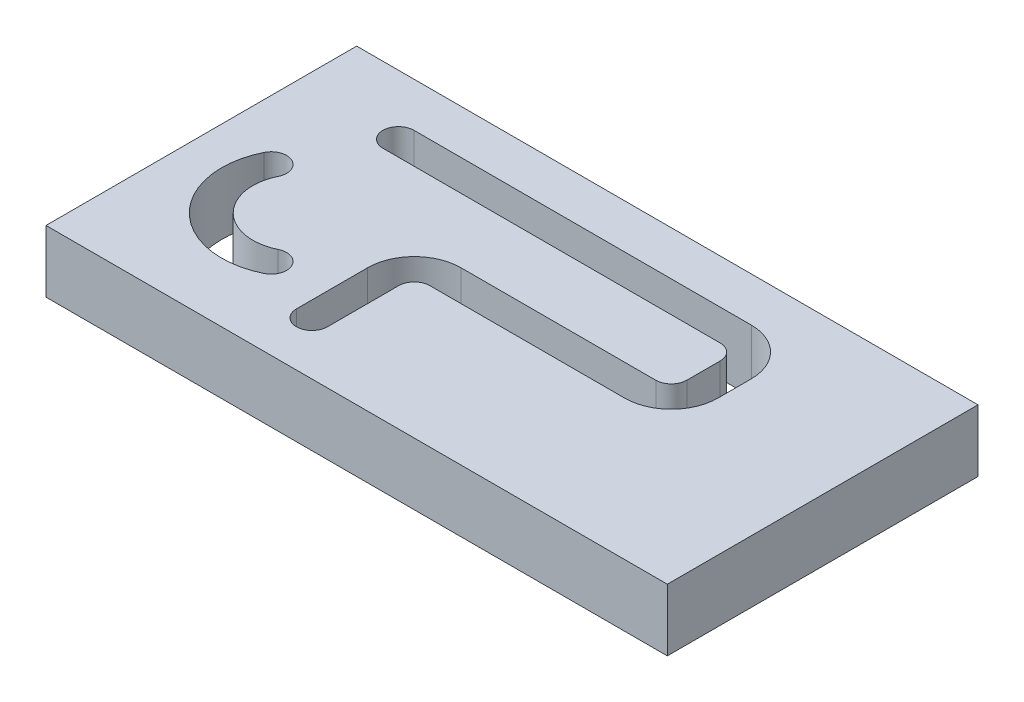
ISO-10303-21;
HEADER;
FILE_DESCRIPTION(('STEP AP214'),'2;1');
FILE_NAME('part.step','',(''),(''),'','','');
FILE_SCHEMA(('AUTOMOTIVE_DESIGN { 1 0 10303 214 1 1 1 1 }'));
ENDSEC;
DATA;
#1=APPLICATION_CONTEXT('core data for automotive mechanical design processes');
#2=APPLICATION_PROTOCOL_DEFINITION('international standard','automotive_design',2000,#1);
#3=PRODUCT_CONTEXT('',#1,'mechanical');
#4=PRODUCT('Part','Part','',(#3));
#5=PRODUCT_RELATED_PRODUCT_CATEGORY('part','',(#4));
#6=PRODUCT_DEFINITION_FORMATION('','',#4);
#7=PRODUCT_DEFINITION_CONTEXT('part definition',#1,'design');
#8=PRODUCT_DEFINITION('design','',#6,#7);
#9=PRODUCT_DEFINITION_SHAPE('','',#8);
#10=(LENGTH_UNIT() NAMED_UNIT(*) SI_UNIT(.MILLI.,.METRE.));
#11=(NAMED_UNIT(*) PLANE_ANGLE_UNIT() SI_UNIT($,.RADIAN.));
#12=(NAMED_UNIT(*) SI_UNIT($,.STERADIAN.) SOLID_ANGLE_UNIT());
#13=UNCERTAINTY_MEASURE_WITH_UNIT(LENGTH_MEASURE(1.E-05),#10,'distance_accuracy_value','');
#14=(GEOMETRIC_REPRESENTATION_CONTEXT(3) GLOBAL_UNCERTAINTY_ASSIGNED_CONTEXT((#13)) GLOBAL_UNIT_ASSIGNED_CONTEXT((#10,
#11,#12)) REPRESENTATION_CONTEXT('',''));
#15=CARTESIAN_POINT('',(0.,0.,0.));
#16=DIRECTION('',(0.,0.,1.));
#17=DIRECTION('',(1.,0.,0.));
#18=AXIS2_PLACEMENT_3D('',#15,#16,#17);
#19=CARTESIAN_POINT('',(-127.,25.4,63.5));
#20=DIRECTION('',(1.,0.,0.));
#21=DIRECTION('',(0.,0.,-1.));
#22=AXIS2_PLACEMENT_3D('',#19,#20,#21);
#23=PLANE('',#22);
#24=DIRECTION('',(0.,0.,1.));
#25=VECTOR('',#24,1.);
#26=CARTESIAN_POINT('',(-127.,0.,63.5));
#27=LINE('',#26,#25);
#28=CARTESIAN_POINT('',(-127.,0.,-63.5));
#29=VERTEX_POINT('',#28);
#30=CARTESIAN_POINT('',(-127.,0.,63.5));
#31=VERTEX_POINT('',#30);
#32=EDGE_CURVE('E327',#29,#31,#27,.T.);
#33=ORIENTED_EDGE('',*,*,#32,.T.);
#34=DIRECTION('',(0.,-1.,0.));
#35=VECTOR('',#34,1.);
#36=CARTESIAN_POINT('',(-127.,25.4,63.5));
#37=LINE('',#36,#35);
#38=CARTESIAN_POINT('',(-127.,25.4,63.5));
#39=VERTEX_POINT('',#38);
#40=EDGE_CURVE('E11',#39,#31,#37,.T.);
#41=ORIENTED_EDGE('',*,*,#40,.F.);
#42=DIRECTION('',(0.,0.,1.));
#43=VECTOR('',#42,1.);
#44=CARTESIAN_POINT('',(-127.,25.4,63.5));
#45=LINE('',#44,#43);
#46=CARTESIAN_POINT('',(-127.,25.4,-63.5));
#47=VERTEX_POINT('',#46);
#48=EDGE_CURVE('E358',#47,#39,#45,.T.);
#49=ORIENTED_EDGE('',*,*,#48,.F.);
#50=DIRECTION('',(0.,-1.,0.));
#51=VECTOR('',#50,1.);
#52=CARTESIAN_POINT('',(-127.,25.4,-63.5));
#53=LINE('',#52,#51);
#54=EDGE_CURVE('E368',#47,#29,#53,.T.);
#55=ORIENTED_EDGE('',*,*,#54,.T.);
#56=EDGE_LOOP('',(#33,#41,#49,#55));
#57=FACE_BOUND('',#56,.T.);
#58=ADVANCED_FACE('F33',(#57),#23,.F.);
#59=CARTESIAN_POINT('',(127.,25.4,63.5));
#60=DIRECTION('',(0.,0.,-1.));
#61=DIRECTION('',(-1.,0.,0.));
#62=AXIS2_PLACEMENT_3D('',#59,#60,#61);
#63=PLANE('',#62);
#64=DIRECTION('',(1.,0.,0.));
#65=VECTOR('',#64,1.);
#66=CARTESIAN_POINT('',(127.,0.,63.5));
#67=LINE('',#66,#65);
#68=CARTESIAN_POINT('',(127.,0.,63.5));
#69=VERTEX_POINT('',#68);
#70=EDGE_CURVE('E371',#31,#69,#67,.T.);
#71=ORIENTED_EDGE('',*,*,#70,.T.);
#72=DIRECTION('',(0.,-1.,0.));
#73=VECTOR('',#72,1.);
#74=CARTESIAN_POINT('',(127.,25.4,63.5));
#75=LINE('',#74,#73);
#76=CARTESIAN_POINT('',(127.,25.4,63.5));
#77=VERTEX_POINT('',#76);
#78=EDGE_CURVE('E40',#77,#69,#75,.T.);
#79=ORIENTED_EDGE('',*,*,#78,.F.);
#80=DIRECTION('',(1.,0.,0.));
#81=VECTOR('',#80,1.);
#82=CARTESIAN_POINT('',(127.,25.4,63.5));
#83=LINE('',#82,#81);
#84=EDGE_CURVE('E361',#39,#77,#83,.T.);
#85=ORIENTED_EDGE('',*,*,#84,.F.);
#86=ORIENTED_EDGE('',*,*,#40,.T.);
#87=EDGE_LOOP('',(#71,#79,#85,#86));
#88=FACE_BOUND('',#87,.T.);
#89=ADVANCED_FACE('F400',(#88),#63,.F.);
#90=CARTESIAN_POINT('',(127.,25.4,63.5));
#91=DIRECTION('',(-1.,0.,0.));
#92=DIRECTION('',(0.,0.,1.));
#93=AXIS2_PLACEMENT_3D('',#90,#91,#92);
#94=PLANE('',#93);
#95=DIRECTION('',(0.,0.,-1.));
#96=VECTOR('',#95,1.);
#97=CARTESIAN_POINT('',(127.,0.,63.5));
#98=LINE('',#97,#96);
#99=CARTESIAN_POINT('',(127.,0.,-63.5));
#100=VERTEX_POINT('',#99);
#101=EDGE_CURVE('E373',#69,#100,#98,.T.);
#102=ORIENTED_EDGE('',*,*,#101,.T.);
#103=DIRECTION('',(0.,-1.,0.));
#104=VECTOR('',#103,1.);
#105=CARTESIAN_POINT('',(127.,25.4,-63.5));
#106=LINE('',#105,#104);
#107=CARTESIAN_POINT('',(127.,25.4,-63.5));
#108=VERTEX_POINT('',#107);
#109=EDGE_CURVE('E378',#108,#100,#106,.T.);
#110=ORIENTED_EDGE('',*,*,#109,.F.);
#111=DIRECTION('',(0.,0.,-1.));
#112=VECTOR('',#111,1.);
#113=CARTESIAN_POINT('',(127.,25.4,63.5));
#114=LINE('',#113,#112);
#115=EDGE_CURVE('E364',#77,#108,#114,.T.);
#116=ORIENTED_EDGE('',*,*,#115,.F.);
#117=ORIENTED_EDGE('',*,*,#78,.T.);
#118=EDGE_LOOP('',(#102,#110,#116,#117));
#119=FACE_BOUND('',#118,.T.);
#120=ADVANCED_FACE('F385',(#119),#94,.F.);
#121=CARTESIAN_POINT('',(127.,25.4,-63.5));
#122=DIRECTION('',(0.,0.,1.));
#123=DIRECTION('',(1.,0.,0.));
#124=AXIS2_PLACEMENT_3D('',#121,#122,#123);
#125=PLANE('',#124);
#126=DIRECTION('',(-1.,0.,0.));
#127=VECTOR('',#126,1.);
#128=CARTESIAN_POINT('',(127.,0.,-63.5));
#129=LINE('',#128,#127);
#130=EDGE_CURVE('E362',#100,#29,#129,.T.);
#131=ORIENTED_EDGE('',*,*,#130,.T.);
#132=ORIENTED_EDGE('',*,*,#54,.F.);
#133=DIRECTION('',(-1.,0.,0.));
#134=VECTOR('',#133,1.);
#135=CARTESIAN_POINT('',(127.,25.4,-63.5));
#136=LINE('',#135,#134);
#137=EDGE_CURVE('E366',#108,#47,#136,.T.);
#138=ORIENTED_EDGE('',*,*,#137,.F.);
#139=ORIENTED_EDGE('',*,*,#109,.T.);
#140=EDGE_LOOP('',(#131,#132,#138,#139));
#141=FACE_BOUND('',#140,.T.);
#142=ADVANCED_FACE('F393',(#141),#125,.F.);
#143=CARTESIAN_POINT('',(0.,25.4,0.));
#144=DIRECTION('',(0.,1.,0.));
#145=DIRECTION('',(0.,0.,1.));
#146=AXIS2_PLACEMENT_3D('',#143,#144,#145);
#147=PLANE('',#146);
#148=CARTESIAN_POINT('',(-102.609854376805,25.4,-4.11536078263867));
#149=DIRECTION('',(0.,1.,0.));
#150=DIRECTION('',(0.,0.,1.));
#151=AXIS2_PLACEMENT_3D('',#148,#149,#150);
#152=CIRCLE('',#151,6.35);
#153=CARTESIAN_POINT('',(-96.8979910878512,25.4,-1.34099278824665));
#154=VERTEX_POINT('',#153);
#155=CARTESIAN_POINT('',(-108.321717665758,25.4,-6.88972877703071));
#156=VERTEX_POINT('',#155);
#157=EDGE_CURVE('E47',#154,#156,#152,.T.);
#158=ORIENTED_EDGE('',*,*,#157,.F.);
#159=CARTESIAN_POINT('',(-79.4838943548142,25.4,7.11738763567236));
#160=DIRECTION('',(0.,-1.,0.));
#161=DIRECTION('',(0.,0.,1.));
#162=AXIS2_PLACEMENT_3D('',#159,#160,#161);
#163=CIRCLE('',#162,19.3596220113748);
#164=CARTESIAN_POINT('',(-71.0255139308952,25.4,24.5314843687094));
#165=VERTEX_POINT('',#164);
#166=EDGE_CURVE('E211',#165,#154,#163,.T.);
#167=ORIENTED_EDGE('',*,*,#166,.F.);
#168=CARTESIAN_POINT('',(-68.2511459365032,25.4,30.2433476576628));
#169=DIRECTION('',(0.,1.,0.));
#170=DIRECTION('',(0.,0.,1.));
#171=AXIS2_PLACEMENT_3D('',#168,#169,#170);
#172=CIRCLE('',#171,6.35);
#173=CARTESIAN_POINT('',(-65.4767779421111,25.4,35.9552109466161));
#174=VERTEX_POINT('',#173);
#175=EDGE_CURVE('E214',#174,#165,#172,.T.);
#176=ORIENTED_EDGE('',*,*,#175,.F.);
#177=CARTESIAN_POINT('',(-79.4838943548142,25.4,7.11738763567236));
#178=DIRECTION('',(0.,1.,0.));
#179=DIRECTION('',(0.,0.,1.));
#180=AXIS2_PLACEMENT_3D('',#177,#178,#179);
#181=CIRCLE('',#180,32.0596220113748);
#182=EDGE_CURVE('E220',#156,#174,#181,.T.);
#183=ORIENTED_EDGE('',*,*,#182,.F.);
#184=EDGE_LOOP('',(#158,#167,#176,#183));
#185=FACE_BOUND('',#184,.T.);
#186=CARTESIAN_POINT('',(-85.466243436315,25.4,-39.044846331769));
#187=DIRECTION('',(0.,1.,0.));
#188=DIRECTION('',(0.,0.,-1.));
#189=AXIS2_PLACEMENT_3D('',#186,#187,#188);
#190=CIRCLE('',#189,6.35);
#191=CARTESIAN_POINT('',(-85.466243436315,25.4,-45.394846331769));
#192=VERTEX_POINT('',#191);
#193=CARTESIAN_POINT('',(-85.466243436315,25.4,-32.694846331769));
#194=VERTEX_POINT('',#193);
#195=EDGE_CURVE('E226',#192,#194,#190,.T.);
#196=ORIENTED_EDGE('',*,*,#195,.F.);
#197=DIRECTION('',(-1.,0.,0.));
#198=VECTOR('',#197,1.);
#199=CARTESIAN_POINT('',(-85.466243436315,25.4,-45.394846331769));
#200=LINE('',#199,#198);
#201=CARTESIAN_POINT('',(52.4171378562399,25.4,-45.394846331769));
#202=VERTEX_POINT('',#201);
#203=EDGE_CURVE('E234',#202,#192,#200,.T.);
#204=ORIENTED_EDGE('',*,*,#203,.F.);
#205=CARTESIAN_POINT('',(52.41713785624,25.4,-26.344846331769));
#206=DIRECTION('',(0.,1.,0.));
#207=DIRECTION('',(0.,0.,-1.));
#208=AXIS2_PLACEMENT_3D('',#205,#206,#207);
#209=CIRCLE('',#208,19.05);
#210=CARTESIAN_POINT('',(71.46713785624,25.4,-26.3448463317689));
#211=VERTEX_POINT('',#210);
#212=EDGE_CURVE('E320',#211,#202,#209,.T.);
#213=ORIENTED_EDGE('',*,*,#212,.F.);
#214=DIRECTION('',(0.,0.,-1.));
#215=VECTOR('',#214,1.);
#216=CARTESIAN_POINT('',(71.46713785624,25.4,-26.3448463317689));
#217=LINE('',#216,#215);
#218=CARTESIAN_POINT('',(71.46713785624,25.4,-12.7000000000001));
#219=VERTEX_POINT('',#218);
#220=EDGE_CURVE('E317',#219,#211,#217,.T.);
#221=ORIENTED_EDGE('',*,*,#220,.F.);
#222=CARTESIAN_POINT('',(52.41713785624,25.4,-12.7));
#223=DIRECTION('',(0.,1.,0.));
#224=DIRECTION('',(0.,0.,-1.));
#225=AXIS2_PLACEMENT_3D('',#222,#223,#224);
#226=CIRCLE('',#225,19.05);
#227=CARTESIAN_POINT('',(52.4171378562399,25.4,6.35));
#228=VERTEX_POINT('',#227);
#229=EDGE_CURVE('E314',#228,#219,#226,.T.);
#230=ORIENTED_EDGE('',*,*,#229,.F.);
#231=DIRECTION('',(1.,0.,0.));
#232=VECTOR('',#231,1.);
#233=CARTESIAN_POINT('',(52.4171378562399,25.4,6.35));
#234=LINE('',#233,#232);
#235=CARTESIAN_POINT('',(-27.2351197008971,25.4,6.35));
#236=VERTEX_POINT('',#235);
#237=EDGE_CURVE('E311',#236,#228,#234,.T.);
#238=ORIENTED_EDGE('',*,*,#237,.F.);
#239=CARTESIAN_POINT('',(-27.2351197008972,25.4,12.7));
#240=DIRECTION('',(0.,-1.,0.));
#241=DIRECTION('',(0.,0.,1.));
#242=AXIS2_PLACEMENT_3D('',#239,#240,#241);
#243=CIRCLE('',#242,6.35);
#244=CARTESIAN_POINT('',(-33.5851197008972,25.4,12.7));
#245=VERTEX_POINT('',#244);
#246=EDGE_CURVE('E308',#245,#236,#243,.T.);
#247=ORIENTED_EDGE('',*,*,#246,.F.);
#248=DIRECTION('',(0.,0.,-1.));
#249=VECTOR('',#248,1.);
#250=CARTESIAN_POINT('',(-33.5851197008972,25.4,12.7));
#251=LINE('',#250,#249);
#252=CARTESIAN_POINT('',(-33.5851197008972,25.4,41.8428483490291));
#253=VERTEX_POINT('',#252);
#254=EDGE_CURVE('E305',#253,#245,#251,.T.);
#255=ORIENTED_EDGE('',*,*,#254,.F.);
#256=CARTESIAN_POINT('',(-39.9351197008972,25.4,41.8428483490291));
#257=DIRECTION('',(0.,1.,0.));
#258=DIRECTION('',(0.,0.,1.));
#259=AXIS2_PLACEMENT_3D('',#256,#257,#258);
#260=CIRCLE('',#259,6.35);
#261=CARTESIAN_POINT('',(-46.2851197008972,25.4,41.8428483490291));
#262=VERTEX_POINT('',#261);
#263=EDGE_CURVE('E302',#262,#253,#260,.T.);
#264=ORIENTED_EDGE('',*,*,#263,.F.);
#265=DIRECTION('',(0.,0.,1.));
#266=VECTOR('',#265,1.);
#267=CARTESIAN_POINT('',(-46.2851197008972,25.4,12.7000000000001));
#268=LINE('',#267,#266);
#269=CARTESIAN_POINT('',(-46.2851197008972,25.4,12.7000000000001));
#270=VERTEX_POINT('',#269);
#271=EDGE_CURVE('E299',#270,#262,#268,.T.);
#272=ORIENTED_EDGE('',*,*,#271,.F.);
#273=CARTESIAN_POINT('',(-27.2351197008972,25.4,12.7));
#274=DIRECTION('',(0.,1.,0.));
#275=DIRECTION('',(0.,0.,1.));
#276=AXIS2_PLACEMENT_3D('',#273,#274,#275);
#277=CIRCLE('',#276,19.05);
#278=CARTESIAN_POINT('',(-27.2351197008971,25.4,-6.35));
#279=VERTEX_POINT('',#278);
#280=EDGE_CURVE('E296',#279,#270,#277,.T.);
#281=ORIENTED_EDGE('',*,*,#280,.F.);
#282=DIRECTION('',(-1.,0.,0.));
#283=VECTOR('',#282,1.);
#284=CARTESIAN_POINT('',(52.41713785624,25.4,-6.35));
#285=LINE('',#284,#283);
#286=CARTESIAN_POINT('',(52.41713785624,25.4,-6.35));
#287=VERTEX_POINT('',#286);
#288=EDGE_CURVE('E293',#287,#279,#285,.T.);
#289=ORIENTED_EDGE('',*,*,#288,.F.);
#290=CARTESIAN_POINT('',(52.41713785624,25.4,-12.7));
#291=DIRECTION('',(0.,-1.,0.));
#292=DIRECTION('',(0.,0.,-1.));
#293=AXIS2_PLACEMENT_3D('',#290,#291,#292);
#294=CIRCLE('',#293,6.35);
#295=CARTESIAN_POINT('',(58.76713785624,25.4,-12.7000000000001));
#296=VERTEX_POINT('',#295);
#297=EDGE_CURVE('E290',#296,#287,#294,.T.);
#298=ORIENTED_EDGE('',*,*,#297,.F.);
#299=DIRECTION('',(0.,0.,1.));
#300=VECTOR('',#299,1.);
#301=CARTESIAN_POINT('',(58.76713785624,25.4,-26.3448463317689));
#302=LINE('',#301,#300);
#303=CARTESIAN_POINT('',(58.76713785624,25.4,-26.3448463317689));
#304=VERTEX_POINT('',#303);
#305=EDGE_CURVE('E287',#304,#296,#302,.T.);
#306=ORIENTED_EDGE('',*,*,#305,.F.);
#307=CARTESIAN_POINT('',(52.41713785624,25.4,-26.344846331769));
#308=DIRECTION('',(0.,-1.,0.));
#309=DIRECTION('',(0.,0.,-1.));
#310=AXIS2_PLACEMENT_3D('',#307,#308,#309);
#311=CIRCLE('',#310,6.35);
#312=CARTESIAN_POINT('',(52.4171378562399,25.4,-32.694846331769));
#313=VERTEX_POINT('',#312);
#314=EDGE_CURVE('E284',#313,#304,#311,.T.);
#315=ORIENTED_EDGE('',*,*,#314,.F.);
#316=DIRECTION('',(1.,0.,0.));
#317=VECTOR('',#316,1.);
#318=CARTESIAN_POINT('',(-85.466243436315,25.4,-32.694846331769));
#319=LINE('',#318,#317);
#320=EDGE_CURVE('E281',#194,#313,#319,.T.);
#321=ORIENTED_EDGE('',*,*,#320,.F.);
#322=EDGE_LOOP('',(#196,#204,#213,#221,#230,#238,#247,#255,#264,#272,#281,#289,#298,#306,#315,#321));
#323=FACE_BOUND('',#322,.T.);
#324=ORIENTED_EDGE('',*,*,#48,.T.);
#325=ORIENTED_EDGE('',*,*,#84,.T.);
#326=ORIENTED_EDGE('',*,*,#115,.T.);
#327=ORIENTED_EDGE('',*,*,#137,.T.);
#328=EDGE_LOOP('',(#324,#325,#326,#327));
#329=FACE_BOUND('',#328,.T.);
#330=ADVANCED_FACE('F399',(#185,#323,#329),#147,.T.);
#331=CARTESIAN_POINT('',(0.,0.,0.));
#332=DIRECTION('',(0.,1.,0.));
#333=DIRECTION('',(0.,0.,1.));
#334=AXIS2_PLACEMENT_3D('',#331,#332,#333);
#335=PLANE('',#334);
#336=CARTESIAN_POINT('',(-79.4838943548142,0.,7.11738763567236));
#337=DIRECTION('',(0.,-1.,0.));
#338=DIRECTION('',(0.,0.,1.));
#339=AXIS2_PLACEMENT_3D('',#336,#337,#338);
#340=CIRCLE('',#339,19.3596220113748);
#341=CARTESIAN_POINT('',(-71.0255139308952,0.,24.5314843687094));
#342=VERTEX_POINT('',#341);
#343=CARTESIAN_POINT('',(-96.8979910878512,0.,-1.34099278824665));
#344=VERTEX_POINT('',#343);
#345=EDGE_CURVE('E201',#342,#344,#340,.T.);
#346=ORIENTED_EDGE('',*,*,#345,.T.);
#347=CARTESIAN_POINT('',(-102.609854376805,0.,-4.11536078263867));
#348=DIRECTION('',(0.,1.,0.));
#349=DIRECTION('',(0.,0.,1.));
#350=AXIS2_PLACEMENT_3D('',#347,#348,#349);
#351=CIRCLE('',#350,6.35);
#352=CARTESIAN_POINT('',(-108.321717665758,0.,-6.88972877703071));
#353=VERTEX_POINT('',#352);
#354=EDGE_CURVE('E195',#344,#353,#351,.T.);
#355=ORIENTED_EDGE('',*,*,#354,.T.);
#356=CARTESIAN_POINT('',(-79.4838943548142,0.,7.11738763567236));
#357=DIRECTION('',(0.,1.,0.));
#358=DIRECTION('',(0.,0.,1.));
#359=AXIS2_PLACEMENT_3D('',#356,#357,#358);
#360=CIRCLE('',#359,32.0596220113748);
#361=CARTESIAN_POINT('',(-65.4767779421111,0.,35.9552109466161));
#362=VERTEX_POINT('',#361);
#363=EDGE_CURVE('E204',#353,#362,#360,.T.);
#364=ORIENTED_EDGE('',*,*,#363,.T.);
#365=CARTESIAN_POINT('',(-68.2511459365032,0.,30.2433476576628));
#366=DIRECTION('',(0.,1.,0.));
#367=DIRECTION('',(0.,0.,1.));
#368=AXIS2_PLACEMENT_3D('',#365,#366,#367);
#369=CIRCLE('',#368,6.35);
#370=EDGE_CURVE('E55',#362,#342,#369,.T.);
#371=ORIENTED_EDGE('',*,*,#370,.T.);
#372=EDGE_LOOP('',(#346,#355,#364,#371));
#373=FACE_BOUND('',#372,.T.);
#374=DIRECTION('',(-1.,0.,0.));
#375=VECTOR('',#374,1.);
#376=CARTESIAN_POINT('',(-85.466243436315,0.,-45.394846331769));
#377=LINE('',#376,#375);
#378=CARTESIAN_POINT('',(52.4171378562399,0.,-45.394846331769));
#379=VERTEX_POINT('',#378);
#380=CARTESIAN_POINT('',(-85.466243436315,0.,-45.394846331769));
#381=VERTEX_POINT('',#380);
#382=EDGE_CURVE('E276',#379,#381,#377,.T.);
#383=ORIENTED_EDGE('',*,*,#382,.T.);
#384=CARTESIAN_POINT('',(-85.466243436315,0.,-39.044846331769));
#385=DIRECTION('',(0.,1.,0.));
#386=DIRECTION('',(0.,0.,-1.));
#387=AXIS2_PLACEMENT_3D('',#384,#385,#386);
#388=CIRCLE('',#387,6.35);
#389=CARTESIAN_POINT('',(-85.466243436315,0.,-32.694846331769));
#390=VERTEX_POINT('',#389);
#391=EDGE_CURVE('E230',#381,#390,#388,.T.);
#392=ORIENTED_EDGE('',*,*,#391,.T.);
#393=DIRECTION('',(1.,0.,0.));
#394=VECTOR('',#393,1.);
#395=CARTESIAN_POINT('',(-85.466243436315,0.,-32.694846331769));
#396=LINE('',#395,#394);
#397=CARTESIAN_POINT('',(52.4171378562399,0.,-32.694846331769));
#398=VERTEX_POINT('',#397);
#399=EDGE_CURVE('E233',#390,#398,#396,.T.);
#400=ORIENTED_EDGE('',*,*,#399,.T.);
#401=CARTESIAN_POINT('',(52.41713785624,0.,-26.344846331769));
#402=DIRECTION('',(0.,-1.,0.));
#403=DIRECTION('',(0.,0.,-1.));
#404=AXIS2_PLACEMENT_3D('',#401,#402,#403);
#405=CIRCLE('',#404,6.35);
#406=CARTESIAN_POINT('',(58.76713785624,0.,-26.3448463317689));
#407=VERTEX_POINT('',#406);
#408=EDGE_CURVE('E237',#398,#407,#405,.T.);
#409=ORIENTED_EDGE('',*,*,#408,.T.);
#410=DIRECTION('',(0.,0.,1.));
#411=VECTOR('',#410,1.);
#412=CARTESIAN_POINT('',(58.76713785624,0.,-26.3448463317689));
#413=LINE('',#412,#411);
#414=CARTESIAN_POINT('',(58.76713785624,0.,-12.7000000000001));
#415=VERTEX_POINT('',#414);
#416=EDGE_CURVE('E240',#407,#415,#413,.T.);
#417=ORIENTED_EDGE('',*,*,#416,.T.);
#418=CARTESIAN_POINT('',(52.41713785624,0.,-12.7));
#419=DIRECTION('',(0.,-1.,0.));
#420=DIRECTION('',(0.,0.,-1.));
#421=AXIS2_PLACEMENT_3D('',#418,#419,#420);
#422=CIRCLE('',#421,6.35);
#423=CARTESIAN_POINT('',(52.41713785624,0.,-6.35));
#424=VERTEX_POINT('',#423);
#425=EDGE_CURVE('E243',#415,#424,#422,.T.);
#426=ORIENTED_EDGE('',*,*,#425,.T.);
#427=DIRECTION('',(-1.,0.,0.));
#428=VECTOR('',#427,1.);
#429=CARTESIAN_POINT('',(52.41713785624,0.,-6.35));
#430=LINE('',#429,#428);
#431=CARTESIAN_POINT('',(-27.2351197008971,0.,-6.35));
#432=VERTEX_POINT('',#431);
#433=EDGE_CURVE('E246',#424,#432,#430,.T.);
#434=ORIENTED_EDGE('',*,*,#433,.T.);
#435=CARTESIAN_POINT('',(-27.2351197008972,0.,12.7));
#436=DIRECTION('',(0.,1.,0.));
#437=DIRECTION('',(0.,0.,1.));
#438=AXIS2_PLACEMENT_3D('',#435,#436,#437);
#439=CIRCLE('',#438,19.05);
#440=CARTESIAN_POINT('',(-46.2851197008972,0.,12.7000000000001));
#441=VERTEX_POINT('',#440);
#442=EDGE_CURVE('E249',#432,#441,#439,.T.);
#443=ORIENTED_EDGE('',*,*,#442,.T.);
#444=DIRECTION('',(0.,0.,1.));
#445=VECTOR('',#444,1.);
#446=CARTESIAN_POINT('',(-46.2851197008972,0.,12.7000000000001));
#447=LINE('',#446,#445);
#448=CARTESIAN_POINT('',(-46.2851197008972,0.,41.8428483490291));
#449=VERTEX_POINT('',#448);
#450=EDGE_CURVE('E252',#441,#449,#447,.T.);
#451=ORIENTED_EDGE('',*,*,#450,.T.);
#452=CARTESIAN_POINT('',(-39.9351197008972,0.,41.8428483490291));
#453=DIRECTION('',(0.,1.,0.));
#454=DIRECTION('',(0.,0.,1.));
#455=AXIS2_PLACEMENT_3D('',#452,#453,#454);
#456=CIRCLE('',#455,6.35);
#457=CARTESIAN_POINT('',(-33.5851197008972,0.,41.8428483490291));
#458=VERTEX_POINT('',#457);
#459=EDGE_CURVE('E255',#449,#458,#456,.T.);
#460=ORIENTED_EDGE('',*,*,#459,.T.);
#461=DIRECTION('',(0.,0.,-1.));
#462=VECTOR('',#461,1.);
#463=CARTESIAN_POINT('',(-33.5851197008972,0.,12.7));
#464=LINE('',#463,#462);
#465=CARTESIAN_POINT('',(-33.5851197008972,0.,12.7));
#466=VERTEX_POINT('',#465);
#467=EDGE_CURVE('E258',#458,#466,#464,.T.);
#468=ORIENTED_EDGE('',*,*,#467,.T.);
#469=CARTESIAN_POINT('',(-27.2351197008972,0.,12.7));
#470=DIRECTION('',(0.,-1.,0.));
#471=DIRECTION('',(0.,0.,1.));
#472=AXIS2_PLACEMENT_3D('',#469,#470,#471);
#473=CIRCLE('',#472,6.35);
#474=CARTESIAN_POINT('',(-27.2351197008971,0.,6.35));
#475=VERTEX_POINT('',#474);
#476=EDGE_CURVE('E261',#466,#475,#473,.T.);
#477=ORIENTED_EDGE('',*,*,#476,.T.);
#478=DIRECTION('',(1.,0.,0.));
#479=VECTOR('',#478,1.);
#480=CARTESIAN_POINT('',(52.4171378562399,0.,6.35));
#481=LINE('',#480,#479);
#482=CARTESIAN_POINT('',(52.4171378562399,0.,6.35));
#483=VERTEX_POINT('',#482);
#484=EDGE_CURVE('E264',#475,#483,#481,.T.);
#485=ORIENTED_EDGE('',*,*,#484,.T.);
#486=CARTESIAN_POINT('',(52.41713785624,0.,-12.7));
#487=DIRECTION('',(0.,1.,0.));
#488=DIRECTION('',(0.,0.,-1.));
#489=AXIS2_PLACEMENT_3D('',#486,#487,#488);
#490=CIRCLE('',#489,19.05);
#491=CARTESIAN_POINT('',(71.46713785624,0.,-12.7000000000001));
#492=VERTEX_POINT('',#491);
#493=EDGE_CURVE('E267',#483,#492,#490,.T.);
#494=ORIENTED_EDGE('',*,*,#493,.T.);
#495=DIRECTION('',(0.,0.,-1.));
#496=VECTOR('',#495,1.);
#497=CARTESIAN_POINT('',(71.46713785624,0.,-26.3448463317689));
#498=LINE('',#497,#496);
#499=CARTESIAN_POINT('',(71.46713785624,0.,-26.3448463317689));
#500=VERTEX_POINT('',#499);
#501=EDGE_CURVE('E270',#492,#500,#498,.T.);
#502=ORIENTED_EDGE('',*,*,#501,.T.);
#503=CARTESIAN_POINT('',(52.41713785624,0.,-26.344846331769));
#504=DIRECTION('',(0.,1.,0.));
#505=DIRECTION('',(0.,0.,-1.));
#506=AXIS2_PLACEMENT_3D('',#503,#504,#505);
#507=CIRCLE('',#506,19.05);
#508=EDGE_CURVE('E273',#500,#379,#507,.T.);
#509=ORIENTED_EDGE('',*,*,#508,.T.);
#510=EDGE_LOOP('',(#383,#392,#400,#409,#417,#426,#434,#443,#451,#460,#468,#477,#485,#494,#502,#509));
#511=FACE_BOUND('',#510,.T.);
#512=ORIENTED_EDGE('',*,*,#32,.F.);
#513=ORIENTED_EDGE('',*,*,#130,.F.);
#514=ORIENTED_EDGE('',*,*,#101,.F.);
#515=ORIENTED_EDGE('',*,*,#70,.F.);
#516=EDGE_LOOP('',(#512,#513,#514,#515));
#517=FACE_BOUND('',#516,.T.);
#518=ADVANCED_FACE('F208',(#373,#511,#517),#335,.F.);
#519=CARTESIAN_POINT('',(-85.466243436315,0.,-39.044846331769));
#520=DIRECTION('',(0.,1.,0.));
#521=DIRECTION('',(0.,0.,1.));
#522=AXIS2_PLACEMENT_3D('',#519,#520,#521);
#523=CYLINDRICAL_SURFACE('',#522,6.35);
#524=ORIENTED_EDGE('',*,*,#195,.T.);
#525=DIRECTION('',(0.,1.,0.));
#526=VECTOR('',#525,1.);
#527=CARTESIAN_POINT('',(-85.466243436315,0.,-32.694846331769));
#528=LINE('',#527,#526);
#529=EDGE_CURVE('E279',#390,#194,#528,.T.);
#530=ORIENTED_EDGE('',*,*,#529,.F.);
#531=ORIENTED_EDGE('',*,*,#391,.F.);
#532=DIRECTION('',(0.,1.,0.));
#533=VECTOR('',#532,1.);
#534=CARTESIAN_POINT('',(-85.466243436315,0.,-45.394846331769));
#535=LINE('',#534,#533);
#536=EDGE_CURVE('E325',#381,#192,#535,.T.);
#537=ORIENTED_EDGE('',*,*,#536,.T.);
#538=EDGE_LOOP('',(#524,#530,#531,#537));
#539=FACE_BOUND('',#538,.T.);
#540=ADVANCED_FACE('F412',(#539),#523,.F.);
#541=CARTESIAN_POINT('',(-85.466243436315,0.,-45.394846331769));
#542=DIRECTION('',(0.,0.,-1.));
#543=DIRECTION('',(-1.,0.,0.));
#544=AXIS2_PLACEMENT_3D('',#541,#542,#543);
#545=PLANE('',#544);
#546=ORIENTED_EDGE('',*,*,#203,.T.);
#547=ORIENTED_EDGE('',*,*,#536,.F.);
#548=ORIENTED_EDGE('',*,*,#382,.F.);
#549=DIRECTION('',(0.,1.,0.));
#550=VECTOR('',#549,1.);
#551=CARTESIAN_POINT('',(52.4171378562399,0.,-45.394846331769));
#552=LINE('',#551,#550);
#553=EDGE_CURVE('E328',#379,#202,#552,.T.);
#554=ORIENTED_EDGE('',*,*,#553,.T.);
#555=EDGE_LOOP('',(#546,#547,#548,#554));
#556=FACE_BOUND('',#555,.T.);
#557=ADVANCED_FACE('F418',(#556),#545,.F.);
#558=CARTESIAN_POINT('',(52.41713785624,0.,-26.344846331769));
#559=DIRECTION('',(0.,1.,0.));
#560=DIRECTION('',(0.,0.,1.));
#561=AXIS2_PLACEMENT_3D('',#558,#559,#560);
#562=CYLINDRICAL_SURFACE('',#561,19.05);
#563=ORIENTED_EDGE('',*,*,#212,.T.);
#564=ORIENTED_EDGE('',*,*,#553,.F.);
#565=ORIENTED_EDGE('',*,*,#508,.F.);
#566=DIRECTION('',(0.,1.,0.));
#567=VECTOR('',#566,1.);
#568=CARTESIAN_POINT('',(71.46713785624,0.,-26.3448463317689));
#569=LINE('',#568,#567);
#570=EDGE_CURVE('E330',#500,#211,#569,.T.);
#571=ORIENTED_EDGE('',*,*,#570,.T.);
#572=EDGE_LOOP('',(#563,#564,#565,#571));
#573=FACE_BOUND('',#572,.T.);
#574=ADVANCED_FACE('F471',(#573),#562,.F.);
#575=CARTESIAN_POINT('',(71.46713785624,0.,-26.3448463317689));
#576=DIRECTION('',(1.,0.,0.));
#577=DIRECTION('',(0.,0.,-1.));
#578=AXIS2_PLACEMENT_3D('',#575,#576,#577);
#579=PLANE('',#578);
#580=ORIENTED_EDGE('',*,*,#220,.T.);
#581=ORIENTED_EDGE('',*,*,#570,.F.);
#582=ORIENTED_EDGE('',*,*,#501,.F.);
#583=DIRECTION('',(0.,1.,0.));
#584=VECTOR('',#583,1.);
#585=CARTESIAN_POINT('',(71.46713785624,0.,-12.7000000000001));
#586=LINE('',#585,#584);
#587=EDGE_CURVE('E332',#492,#219,#586,.T.);
#588=ORIENTED_EDGE('',*,*,#587,.T.);
#589=EDGE_LOOP('',(#580,#581,#582,#588));
#590=FACE_BOUND('',#589,.T.);
#591=ADVANCED_FACE('F467',(#590),#579,.F.);
#592=CARTESIAN_POINT('',(52.41713785624,0.,-12.7));
#593=DIRECTION('',(0.,1.,0.));
#594=DIRECTION('',(0.,0.,1.));
#595=AXIS2_PLACEMENT_3D('',#592,#593,#594);
#596=CYLINDRICAL_SURFACE('',#595,19.05);
#597=ORIENTED_EDGE('',*,*,#229,.T.);
#598=ORIENTED_EDGE('',*,*,#587,.F.);
#599=ORIENTED_EDGE('',*,*,#493,.F.);
#600=DIRECTION('',(0.,1.,0.));
#601=VECTOR('',#600,1.);
#602=CARTESIAN_POINT('',(52.4171378562399,0.,6.35));
#603=LINE('',#602,#601);
#604=EDGE_CURVE('E334',#483,#228,#603,.T.);
#605=ORIENTED_EDGE('',*,*,#604,.T.);
#606=EDGE_LOOP('',(#597,#598,#599,#605));
#607=FACE_BOUND('',#606,.T.);
#608=ADVANCED_FACE('F463',(#607),#596,.F.);
#609=CARTESIAN_POINT('',(52.4171378562399,0.,6.35));
#610=DIRECTION('',(0.,0.,1.));
#611=DIRECTION('',(1.,0.,0.));
#612=AXIS2_PLACEMENT_3D('',#609,#610,#611);
#613=PLANE('',#612);
#614=ORIENTED_EDGE('',*,*,#237,.T.);
#615=ORIENTED_EDGE('',*,*,#604,.F.);
#616=ORIENTED_EDGE('',*,*,#484,.F.);
#617=DIRECTION('',(0.,1.,0.));
#618=VECTOR('',#617,1.);
#619=CARTESIAN_POINT('',(-27.2351197008971,0.,6.35));
#620=LINE('',#619,#618);
#621=EDGE_CURVE('E336',#475,#236,#620,.T.);
#622=ORIENTED_EDGE('',*,*,#621,.T.);
#623=EDGE_LOOP('',(#614,#615,#616,#622));
#624=FACE_BOUND('',#623,.T.);
#625=ADVANCED_FACE('F459',(#624),#613,.F.);
#626=CARTESIAN_POINT('',(-27.2351197008972,0.,12.7));
#627=DIRECTION('',(0.,1.,0.));
#628=DIRECTION('',(0.,0.,1.));
#629=AXIS2_PLACEMENT_3D('',#626,#627,#628);
#630=CYLINDRICAL_SURFACE('',#629,6.35);
#631=ORIENTED_EDGE('',*,*,#246,.T.);
#632=ORIENTED_EDGE('',*,*,#621,.F.);
#633=ORIENTED_EDGE('',*,*,#476,.F.);
#634=DIRECTION('',(0.,1.,0.));
#635=VECTOR('',#634,1.);
#636=CARTESIAN_POINT('',(-33.5851197008972,0.,12.7));
#637=LINE('',#636,#635);
#638=EDGE_CURVE('E338',#466,#245,#637,.T.);
#639=ORIENTED_EDGE('',*,*,#638,.T.);
#640=EDGE_LOOP('',(#631,#632,#633,#639));
#641=FACE_BOUND('',#640,.T.);
#642=ADVANCED_FACE('F455',(#641),#630,.T.);
#643=CARTESIAN_POINT('',(-33.5851197008972,0.,12.7));
#644=DIRECTION('',(1.,0.,0.));
#645=DIRECTION('',(0.,0.,-1.));
#646=AXIS2_PLACEMENT_3D('',#643,#644,#645);
#647=PLANE('',#646);
#648=ORIENTED_EDGE('',*,*,#254,.T.);
#649=ORIENTED_EDGE('',*,*,#638,.F.);
#650=ORIENTED_EDGE('',*,*,#467,.F.);
#651=DIRECTION('',(0.,1.,0.));
#652=VECTOR('',#651,1.);
#653=CARTESIAN_POINT('',(-33.5851197008972,0.,41.8428483490291));
#654=LINE('',#653,#652);
#655=EDGE_CURVE('E340',#458,#253,#654,.T.);
#656=ORIENTED_EDGE('',*,*,#655,.T.);
#657=EDGE_LOOP('',(#648,#649,#650,#656));
#658=FACE_BOUND('',#657,.T.);
#659=ADVANCED_FACE('F451',(#658),#647,.F.);
#660=CARTESIAN_POINT('',(-39.9351197008972,0.,41.8428483490291));
#661=DIRECTION('',(0.,1.,0.));
#662=DIRECTION('',(0.,0.,1.));
#663=AXIS2_PLACEMENT_3D('',#660,#661,#662);
#664=CYLINDRICAL_SURFACE('',#663,6.35);
#665=ORIENTED_EDGE('',*,*,#263,.T.);
#666=ORIENTED_EDGE('',*,*,#655,.F.);
#667=ORIENTED_EDGE('',*,*,#459,.F.);
#668=DIRECTION('',(0.,1.,0.));
#669=VECTOR('',#668,1.);
#670=CARTESIAN_POINT('',(-46.2851197008972,0.,41.8428483490291));
#671=LINE('',#670,#669);
#672=EDGE_CURVE('E342',#449,#262,#671,.T.);
#673=ORIENTED_EDGE('',*,*,#672,.T.);
#674=EDGE_LOOP('',(#665,#666,#667,#673));
#675=FACE_BOUND('',#674,.T.);
#676=ADVANCED_FACE('F447',(#675),#664,.F.);
#677=CARTESIAN_POINT('',(-46.2851197008972,0.,12.7000000000001));
#678=DIRECTION('',(-1.,0.,0.));
#679=DIRECTION('',(0.,0.,1.));
#680=AXIS2_PLACEMENT_3D('',#677,#678,#679);
#681=PLANE('',#680);
#682=ORIENTED_EDGE('',*,*,#271,.T.);
#683=ORIENTED_EDGE('',*,*,#672,.F.);
#684=ORIENTED_EDGE('',*,*,#450,.F.);
#685=DIRECTION('',(0.,1.,0.));
#686=VECTOR('',#685,1.);
#687=CARTESIAN_POINT('',(-46.2851197008972,0.,12.7000000000001));
#688=LINE('',#687,#686);
#689=EDGE_CURVE('E344',#441,#270,#688,.T.);
#690=ORIENTED_EDGE('',*,*,#689,.T.);
#691=EDGE_LOOP('',(#682,#683,#684,#690));
#692=FACE_BOUND('',#691,.T.);
#693=ADVANCED_FACE('F443',(#692),#681,.F.);
#694=CARTESIAN_POINT('',(-27.2351197008972,0.,12.7));
#695=DIRECTION('',(0.,1.,0.));
#696=DIRECTION('',(0.,0.,1.));
#697=AXIS2_PLACEMENT_3D('',#694,#695,#696);
#698=CYLINDRICAL_SURFACE('',#697,19.05);
#699=ORIENTED_EDGE('',*,*,#280,.T.);
#700=ORIENTED_EDGE('',*,*,#689,.F.);
#701=ORIENTED_EDGE('',*,*,#442,.F.);
#702=DIRECTION('',(0.,1.,0.));
#703=VECTOR('',#702,1.);
#704=CARTESIAN_POINT('',(-27.2351197008971,0.,-6.35));
#705=LINE('',#704,#703);
#706=EDGE_CURVE('E346',#432,#279,#705,.T.);
#707=ORIENTED_EDGE('',*,*,#706,.T.);
#708=EDGE_LOOP('',(#699,#700,#701,#707));
#709=FACE_BOUND('',#708,.T.);
#710=ADVANCED_FACE('F439',(#709),#698,.F.);
#711=CARTESIAN_POINT('',(52.41713785624,0.,-6.35));
#712=DIRECTION('',(0.,0.,-1.));
#713=DIRECTION('',(-1.,0.,0.));
#714=AXIS2_PLACEMENT_3D('',#711,#712,#713);
#715=PLANE('',#714);
#716=ORIENTED_EDGE('',*,*,#288,.T.);
#717=ORIENTED_EDGE('',*,*,#706,.F.);
#718=ORIENTED_EDGE('',*,*,#433,.F.);
#719=DIRECTION('',(0.,1.,0.));
#720=VECTOR('',#719,1.);
#721=CARTESIAN_POINT('',(52.41713785624,0.,-6.35));
#722=LINE('',#721,#720);
#723=EDGE_CURVE('E348',#424,#287,#722,.T.);
#724=ORIENTED_EDGE('',*,*,#723,.T.);
#725=EDGE_LOOP('',(#716,#717,#718,#724));
#726=FACE_BOUND('',#725,.T.);
#727=ADVANCED_FACE('F435',(#726),#715,.F.);
#728=CARTESIAN_POINT('',(52.41713785624,0.,-12.7));
#729=DIRECTION('',(0.,1.,0.));
#730=DIRECTION('',(0.,0.,1.));
#731=AXIS2_PLACEMENT_3D('',#728,#729,#730);
#732=CYLINDRICAL_SURFACE('',#731,6.35);
#733=ORIENTED_EDGE('',*,*,#297,.T.);
#734=ORIENTED_EDGE('',*,*,#723,.F.);
#735=ORIENTED_EDGE('',*,*,#425,.F.);
#736=DIRECTION('',(0.,1.,0.));
#737=VECTOR('',#736,1.);
#738=CARTESIAN_POINT('',(58.76713785624,0.,-12.7000000000001));
#739=LINE('',#738,#737);
#740=EDGE_CURVE('E350',#415,#296,#739,.T.);
#741=ORIENTED_EDGE('',*,*,#740,.T.);
#742=EDGE_LOOP('',(#733,#734,#735,#741));
#743=FACE_BOUND('',#742,.T.);
#744=ADVANCED_FACE('F431',(#743),#732,.T.);
#745=CARTESIAN_POINT('',(58.76713785624,0.,-26.3448463317689));
#746=DIRECTION('',(-1.,0.,0.));
#747=DIRECTION('',(0.,0.,1.));
#748=AXIS2_PLACEMENT_3D('',#745,#746,#747);
#749=PLANE('',#748);
#750=ORIENTED_EDGE('',*,*,#305,.T.);
#751=ORIENTED_EDGE('',*,*,#740,.F.);
#752=ORIENTED_EDGE('',*,*,#416,.F.);
#753=DIRECTION('',(0.,1.,0.));
#754=VECTOR('',#753,1.);
#755=CARTESIAN_POINT('',(58.76713785624,0.,-26.3448463317689));
#756=LINE('',#755,#754);
#757=EDGE_CURVE('E352',#407,#304,#756,.T.);
#758=ORIENTED_EDGE('',*,*,#757,.T.);
#759=EDGE_LOOP('',(#750,#751,#752,#758));
#760=FACE_BOUND('',#759,.T.);
#761=ADVANCED_FACE('F427',(#760),#749,.F.);
#762=CARTESIAN_POINT('',(52.41713785624,0.,-26.344846331769));
#763=DIRECTION('',(0.,1.,0.));
#764=DIRECTION('',(0.,0.,1.));
#765=AXIS2_PLACEMENT_3D('',#762,#763,#764);
#766=CYLINDRICAL_SURFACE('',#765,6.35);
#767=ORIENTED_EDGE('',*,*,#314,.T.);
#768=ORIENTED_EDGE('',*,*,#757,.F.);
#769=ORIENTED_EDGE('',*,*,#408,.F.);
#770=DIRECTION('',(0.,1.,0.));
#771=VECTOR('',#770,1.);
#772=CARTESIAN_POINT('',(52.4171378562399,0.,-32.694846331769));
#773=LINE('',#772,#771);
#774=EDGE_CURVE('E354',#398,#313,#773,.T.);
#775=ORIENTED_EDGE('',*,*,#774,.T.);
#776=EDGE_LOOP('',(#767,#768,#769,#775));
#777=FACE_BOUND('',#776,.T.);
#778=ADVANCED_FACE('F423',(#777),#766,.T.);
#779=CARTESIAN_POINT('',(-85.466243436315,0.,-32.694846331769));
#780=DIRECTION('',(0.,0.,1.));
#781=DIRECTION('',(1.,0.,0.));
#782=AXIS2_PLACEMENT_3D('',#779,#780,#781);
#783=PLANE('',#782);
#784=ORIENTED_EDGE('',*,*,#320,.T.);
#785=ORIENTED_EDGE('',*,*,#774,.F.);
#786=ORIENTED_EDGE('',*,*,#399,.F.);
#787=ORIENTED_EDGE('',*,*,#529,.T.);
#788=EDGE_LOOP('',(#784,#785,#786,#787));
#789=FACE_BOUND('',#788,.T.);
#790=ADVANCED_FACE('F420',(#789),#783,.F.);
#791=CARTESIAN_POINT('',(-102.609854376805,0.,-4.11536078263867));
#792=DIRECTION('',(0.,1.,0.));
#793=DIRECTION('',(0.,0.,1.));
#794=AXIS2_PLACEMENT_3D('',#791,#792,#793);
#795=CYLINDRICAL_SURFACE('',#794,6.35);
#796=ORIENTED_EDGE('',*,*,#157,.T.);
#797=DIRECTION('',(0.,1.,0.));
#798=VECTOR('',#797,1.);
#799=CARTESIAN_POINT('',(-108.321717665758,0.,-6.88972877703071));
#800=LINE('',#799,#798);
#801=EDGE_CURVE('E191',#353,#156,#800,.T.);
#802=ORIENTED_EDGE('',*,*,#801,.F.);
#803=ORIENTED_EDGE('',*,*,#354,.F.);
#804=DIRECTION('',(0.,1.,0.));
#805=VECTOR('',#804,1.);
#806=CARTESIAN_POINT('',(-96.8979910878512,0.,-1.34099278824665));
#807=LINE('',#806,#805);
#808=EDGE_CURVE('E224',#344,#154,#807,.T.);
#809=ORIENTED_EDGE('',*,*,#808,.T.);
#810=EDGE_LOOP('',(#796,#802,#803,#809));
#811=FACE_BOUND('',#810,.T.);
#812=ADVANCED_FACE('F193',(#811),#795,.F.);
#813=CARTESIAN_POINT('',(-79.4838943548142,0.,7.11738763567236));
#814=DIRECTION('',(0.,1.,0.));
#815=DIRECTION('',(0.,0.,1.));
#816=AXIS2_PLACEMENT_3D('',#813,#814,#815);
#817=CYLINDRICAL_SURFACE('',#816,19.3596220113748);
#818=ORIENTED_EDGE('',*,*,#166,.T.);
#819=ORIENTED_EDGE('',*,*,#808,.F.);
#820=ORIENTED_EDGE('',*,*,#345,.F.);
#821=DIRECTION('',(0.,1.,0.));
#822=VECTOR('',#821,1.);
#823=CARTESIAN_POINT('',(-71.0255139308952,0.,24.5314843687094));
#824=LINE('',#823,#822);
#825=EDGE_CURVE('E227',#342,#165,#824,.T.);
#826=ORIENTED_EDGE('',*,*,#825,.T.);
#827=EDGE_LOOP('',(#818,#819,#820,#826));
#828=FACE_BOUND('',#827,.T.);
#829=ADVANCED_FACE('F481',(#828),#817,.T.);
#830=CARTESIAN_POINT('',(-68.2511459365032,0.,30.2433476576628));
#831=DIRECTION('',(0.,1.,0.));
#832=DIRECTION('',(0.,0.,1.));
#833=AXIS2_PLACEMENT_3D('',#830,#831,#832);
#834=CYLINDRICAL_SURFACE('',#833,6.35);
#835=ORIENTED_EDGE('',*,*,#175,.T.);
#836=ORIENTED_EDGE('',*,*,#825,.F.);
#837=ORIENTED_EDGE('',*,*,#370,.F.);
#838=DIRECTION('',(0.,1.,0.));
#839=VECTOR('',#838,1.);
#840=CARTESIAN_POINT('',(-65.4767779421111,0.,35.9552109466161));
#841=LINE('',#840,#839);
#842=EDGE_CURVE('E200',#362,#174,#841,.T.);
#843=ORIENTED_EDGE('',*,*,#842,.T.);
#844=EDGE_LOOP('',(#835,#836,#837,#843));
#845=FACE_BOUND('',#844,.T.);
#846=ADVANCED_FACE('F484',(#845),#834,.F.);
#847=CARTESIAN_POINT('',(-79.4838943548142,0.,7.11738763567236));
#848=DIRECTION('',(0.,1.,0.));
#849=DIRECTION('',(0.,0.,1.));
#850=AXIS2_PLACEMENT_3D('',#847,#848,#849);
#851=CYLINDRICAL_SURFACE('',#850,32.0596220113748);
#852=ORIENTED_EDGE('',*,*,#182,.T.);
#853=ORIENTED_EDGE('',*,*,#842,.F.);
#854=ORIENTED_EDGE('',*,*,#363,.F.);
#855=ORIENTED_EDGE('',*,*,#801,.T.);
#856=EDGE_LOOP('',(#852,#853,#854,#855));
#857=FACE_BOUND('',#856,.T.);
#858=ADVANCED_FACE('F205',(#857),#851,.F.);
#859=CLOSED_SHELL('',(#58,#89,#120,#142,#330,#518,#540,#557,#574,#591,#608,#625,#642,#659,#676,
#693,#710,#727,#744,#761,#778,#790,#812,#829,#846,#858));
#860=MANIFOLD_SOLID_BREP('B2',#859);
#861=ADVANCED_BREP_SHAPE_REPRESENTATION('',(#18,#860),#14);
#862=SHAPE_DEFINITION_REPRESENTATION(#9,#861);
ENDSEC;
END-ISO-10303-21;
